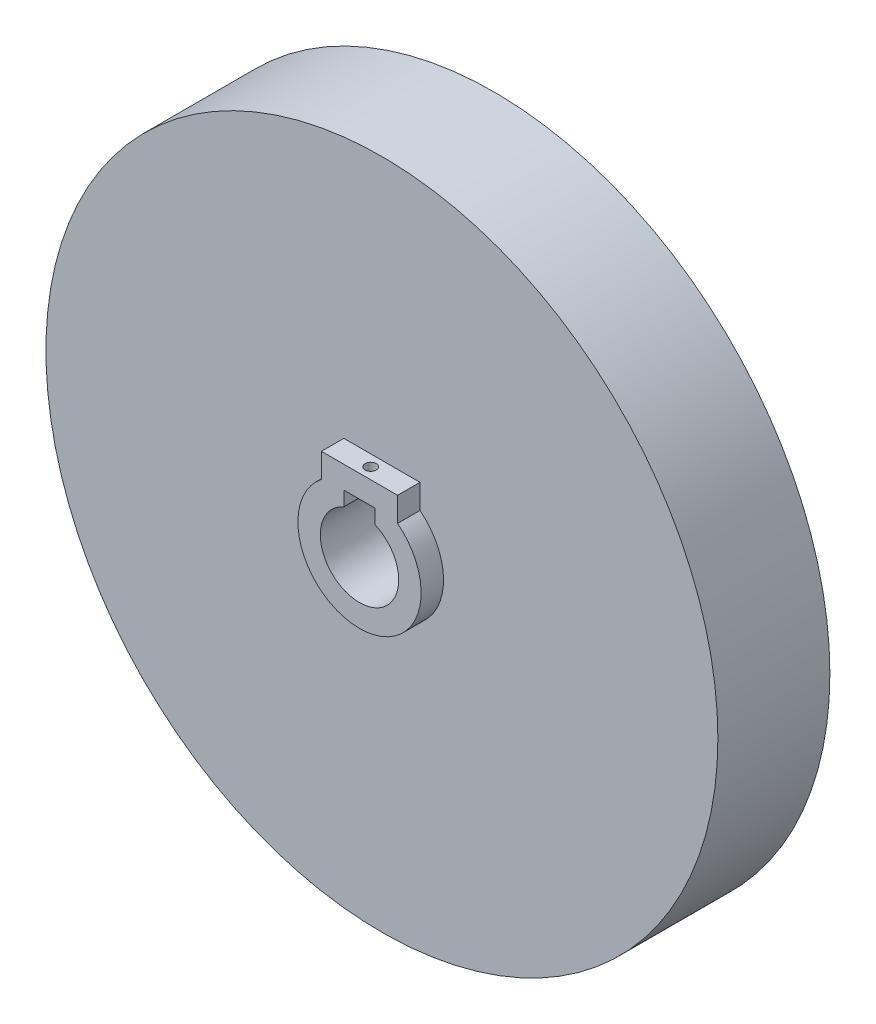
ISO-10303-21;
HEADER;
FILE_DESCRIPTION(('STEP AP214'),'2;1');
FILE_NAME('part.step','',(''),(''),'','','');
FILE_SCHEMA(('AUTOMOTIVE_DESIGN { 1 0 10303 214 1 1 1 1 }'));
ENDSEC;
DATA;
#1=APPLICATION_CONTEXT('core data for automotive mechanical design processes');
#2=APPLICATION_PROTOCOL_DEFINITION('international standard','automotive_design',2000,#1);
#3=PRODUCT_CONTEXT('',#1,'mechanical');
#4=PRODUCT('Part','Part','',(#3));
#5=PRODUCT_RELATED_PRODUCT_CATEGORY('part','',(#4));
#6=PRODUCT_DEFINITION_FORMATION('','',#4);
#7=PRODUCT_DEFINITION_CONTEXT('part definition',#1,'design');
#8=PRODUCT_DEFINITION('design','',#6,#7);
#9=PRODUCT_DEFINITION_SHAPE('','',#8);
#10=(LENGTH_UNIT() NAMED_UNIT(*) SI_UNIT(.MILLI.,.METRE.));
#11=(NAMED_UNIT(*) PLANE_ANGLE_UNIT() SI_UNIT($,.RADIAN.));
#12=(NAMED_UNIT(*) SI_UNIT($,.STERADIAN.) SOLID_ANGLE_UNIT());
#13=UNCERTAINTY_MEASURE_WITH_UNIT(LENGTH_MEASURE(1.E-05),#10,'distance_accuracy_value','');
#14=(GEOMETRIC_REPRESENTATION_CONTEXT(3) GLOBAL_UNCERTAINTY_ASSIGNED_CONTEXT((#13)) GLOBAL_UNIT_ASSIGNED_CONTEXT((#10,
#11,#12)) REPRESENTATION_CONTEXT('',''));
#15=CARTESIAN_POINT('',(0.,0.,0.));
#16=DIRECTION('',(0.,0.,1.));
#17=DIRECTION('',(1.,0.,0.));
#18=AXIS2_PLACEMENT_3D('',#15,#16,#17);
#19=CARTESIAN_POINT('',(0.,0.,50.));
#20=DIRECTION('',(0.,0.,1.));
#21=DIRECTION('',(1.,0.,0.));
#22=AXIS2_PLACEMENT_3D('',#19,#20,#21);
#23=PLANE('',#22);
#24=CARTESIAN_POINT('',(0.,0.,50.));
#25=DIRECTION('',(0.,0.,1.));
#26=DIRECTION('',(1.,0.,0.));
#27=AXIS2_PLACEMENT_3D('',#24,#25,#26);
#28=CIRCLE('',#27,27.5);
#29=CARTESIAN_POINT('',(-17.,21.6159663212173,50.));
#30=VERTEX_POINT('',#29);
#31=CARTESIAN_POINT('',(17.,21.6159663212173,50.));
#32=VERTEX_POINT('',#31);
#33=EDGE_CURVE('E59',#30,#32,#28,.T.);
#34=ORIENTED_EDGE('',*,*,#33,.F.);
#35=DIRECTION('',(0.,-1.,0.));
#36=VECTOR('',#35,1.);
#37=CARTESIAN_POINT('',(-17.,0.,50.));
#38=LINE('',#37,#36);
#39=CARTESIAN_POINT('',(-17.,32.5,50.));
#40=VERTEX_POINT('',#39);
#41=EDGE_CURVE('E63',#40,#30,#38,.T.);
#42=ORIENTED_EDGE('',*,*,#41,.F.);
#43=DIRECTION('',(-1.,0.,0.));
#44=VECTOR('',#43,1.);
#45=CARTESIAN_POINT('',(0.,32.5,50.));
#46=LINE('',#45,#44);
#47=CARTESIAN_POINT('',(17.,32.5,50.));
#48=VERTEX_POINT('',#47);
#49=EDGE_CURVE('E213',#48,#40,#46,.T.);
#50=ORIENTED_EDGE('',*,*,#49,.F.);
#51=DIRECTION('',(0.,1.,0.));
#52=VECTOR('',#51,1.);
#53=CARTESIAN_POINT('',(17.,0.,50.));
#54=LINE('',#53,#52);
#55=EDGE_CURVE('E199',#32,#48,#54,.T.);
#56=ORIENTED_EDGE('',*,*,#55,.F.);
#57=EDGE_LOOP('',(#34,#42,#50,#56));
#58=FACE_BOUND('',#57,.T.);
#59=CARTESIAN_POINT('',(0.,0.,50.));
#60=DIRECTION('',(0.,0.,1.));
#61=DIRECTION('',(1.,0.,0.));
#62=AXIS2_PLACEMENT_3D('',#59,#60,#61);
#63=CIRCLE('',#62,150.);
#64=CARTESIAN_POINT('',(150.,0.,50.));
#65=VERTEX_POINT('',#64);
#66=EDGE_CURVE('E222',#65,#65,#63,.T.);
#67=ORIENTED_EDGE('',*,*,#66,.T.);
#68=EDGE_LOOP('',(#67));
#69=FACE_BOUND('',#68,.T.);
#70=ADVANCED_FACE('F44',(#58,#69),#23,.T.);
#71=CARTESIAN_POINT('',(0.,0.,0.));
#72=DIRECTION('',(0.,0.,1.));
#73=DIRECTION('',(1.,0.,0.));
#74=AXIS2_PLACEMENT_3D('',#71,#72,#73);
#75=PLANE('',#74);
#76=DIRECTION('',(0.,-1.,0.));
#77=VECTOR('',#76,1.);
#78=CARTESIAN_POINT('',(-17.,0.,0.));
#79=LINE('',#78,#77);
#80=CARTESIAN_POINT('',(-17.,32.5,0.));
#81=VERTEX_POINT('',#80);
#82=CARTESIAN_POINT('',(-17.,21.6159663212173,0.));
#83=VERTEX_POINT('',#82);
#84=EDGE_CURVE('E52',#81,#83,#79,.T.);
#85=ORIENTED_EDGE('',*,*,#84,.T.);
#86=CARTESIAN_POINT('',(0.,0.,0.));
#87=DIRECTION('',(0.,0.,1.));
#88=DIRECTION('',(1.,0.,0.));
#89=AXIS2_PLACEMENT_3D('',#86,#87,#88);
#90=CIRCLE('',#89,27.5);
#91=CARTESIAN_POINT('',(17.,21.6159663212173,0.));
#92=VERTEX_POINT('',#91);
#93=EDGE_CURVE('E13',#83,#92,#90,.T.);
#94=ORIENTED_EDGE('',*,*,#93,.T.);
#95=DIRECTION('',(0.,1.,0.));
#96=VECTOR('',#95,1.);
#97=CARTESIAN_POINT('',(17.,0.,0.));
#98=LINE('',#97,#96);
#99=CARTESIAN_POINT('',(17.,32.5,0.));
#100=VERTEX_POINT('',#99);
#101=EDGE_CURVE('E225',#92,#100,#98,.T.);
#102=ORIENTED_EDGE('',*,*,#101,.T.);
#103=DIRECTION('',(-1.,0.,0.));
#104=VECTOR('',#103,1.);
#105=CARTESIAN_POINT('',(0.,32.5,0.));
#106=LINE('',#105,#104);
#107=EDGE_CURVE('E230',#100,#81,#106,.T.);
#108=ORIENTED_EDGE('',*,*,#107,.T.);
#109=EDGE_LOOP('',(#85,#94,#102,#108));
#110=FACE_BOUND('',#109,.T.);
#111=CARTESIAN_POINT('',(0.,0.,0.));
#112=DIRECTION('',(0.,0.,1.));
#113=DIRECTION('',(1.,0.,0.));
#114=AXIS2_PLACEMENT_3D('',#111,#112,#113);
#115=CIRCLE('',#114,150.);
#116=CARTESIAN_POINT('',(150.,0.,0.));
#117=VERTEX_POINT('',#116);
#118=EDGE_CURVE('E221',#117,#117,#115,.T.);
#119=ORIENTED_EDGE('',*,*,#118,.F.);
#120=EDGE_LOOP('',(#119));
#121=FACE_BOUND('',#120,.T.);
#122=ADVANCED_FACE('F234',(#110,#121),#75,.F.);
#123=CARTESIAN_POINT('',(0.,0.,50.));
#124=DIRECTION('',(0.,0.,-1.));
#125=DIRECTION('',(-1.,0.,0.));
#126=AXIS2_PLACEMENT_3D('',#123,#124,#125);
#127=CYLINDRICAL_SURFACE('',#126,150.);
#128=ORIENTED_EDGE('',*,*,#66,.F.);
#129=EDGE_LOOP('',(#128));
#130=FACE_BOUND('',#129,.T.);
#131=ORIENTED_EDGE('',*,*,#118,.T.);
#132=EDGE_LOOP('',(#131));
#133=FACE_BOUND('',#132,.T.);
#134=ADVANCED_FACE('F46',(#130,#133),#127,.T.);
#135=CARTESIAN_POINT('',(17.,21.6159663212173,-9.99999999999999));
#136=DIRECTION('',(1.,0.,0.));
#137=DIRECTION('',(0.,0.,-1.));
#138=AXIS2_PLACEMENT_3D('',#135,#136,#137);
#139=PLANE('',#138);
#140=ORIENTED_EDGE('',*,*,#101,.F.);
#141=DIRECTION('',(0.,0.,1.));
#142=VECTOR('',#141,1.);
#143=CARTESIAN_POINT('',(17.,21.6159663212173,-9.99999999999999));
#144=LINE('',#143,#142);
#145=CARTESIAN_POINT('',(17.,21.6159663212173,-9.99999999999999));
#146=VERTEX_POINT('',#145);
#147=EDGE_CURVE('E208',#146,#92,#144,.T.);
#148=ORIENTED_EDGE('',*,*,#147,.F.);
#149=DIRECTION('',(0.,1.,0.));
#150=VECTOR('',#149,1.);
#151=CARTESIAN_POINT('',(17.,21.6159663212173,-9.99999999999999));
#152=LINE('',#151,#150);
#153=CARTESIAN_POINT('',(17.,32.5,-9.99999999999999));
#154=VERTEX_POINT('',#153);
#155=EDGE_CURVE('E186',#146,#154,#152,.T.);
#156=ORIENTED_EDGE('',*,*,#155,.T.);
#157=DIRECTION('',(0.,0.,1.));
#158=VECTOR('',#157,1.);
#159=CARTESIAN_POINT('',(17.,32.5,-9.99999999999999));
#160=LINE('',#159,#158);
#161=EDGE_CURVE('E205',#154,#100,#160,.T.);
#162=ORIENTED_EDGE('',*,*,#161,.T.);
#163=EDGE_LOOP('',(#140,#148,#156,#162));
#164=FACE_BOUND('',#163,.T.);
#165=ADVANCED_FACE('F250',(#164),#139,.T.);
#166=CARTESIAN_POINT('',(17.,32.5,-9.99999999999999));
#167=DIRECTION('',(0.,1.,0.));
#168=DIRECTION('',(0.,0.,1.));
#169=AXIS2_PLACEMENT_3D('',#166,#167,#168);
#170=PLANE('',#169);
#171=ORIENTED_EDGE('',*,*,#107,.F.);
#172=ORIENTED_EDGE('',*,*,#161,.F.);
#173=DIRECTION('',(-1.,0.,0.));
#174=VECTOR('',#173,1.);
#175=CARTESIAN_POINT('',(17.,32.5,-9.99999999999999));
#176=LINE('',#175,#174);
#177=CARTESIAN_POINT('',(-17.,32.5,-9.99999999999999));
#178=VERTEX_POINT('',#177);
#179=EDGE_CURVE('E189',#154,#178,#176,.T.);
#180=ORIENTED_EDGE('',*,*,#179,.T.);
#181=DIRECTION('',(0.,0.,1.));
#182=VECTOR('',#181,1.);
#183=CARTESIAN_POINT('',(-17.,32.5,-9.99999999999999));
#184=LINE('',#183,#182);
#185=EDGE_CURVE('E201',#178,#81,#184,.T.);
#186=ORIENTED_EDGE('',*,*,#185,.T.);
#187=EDGE_LOOP('',(#171,#172,#180,#186));
#188=FACE_BOUND('',#187,.T.);
#189=ADVANCED_FACE('F240',(#188),#170,.T.);
#190=CARTESIAN_POINT('',(-17.,32.5,-9.99999999999999));
#191=DIRECTION('',(-1.,0.,0.));
#192=DIRECTION('',(0.,0.,1.));
#193=AXIS2_PLACEMENT_3D('',#190,#191,#192);
#194=PLANE('',#193);
#195=ORIENTED_EDGE('',*,*,#84,.F.);
#196=ORIENTED_EDGE('',*,*,#185,.F.);
#197=DIRECTION('',(0.,-1.,0.));
#198=VECTOR('',#197,1.);
#199=CARTESIAN_POINT('',(-17.,32.5,-9.99999999999999));
#200=LINE('',#199,#198);
#201=CARTESIAN_POINT('',(-17.,21.6159663212173,-9.99999999999999));
#202=VERTEX_POINT('',#201);
#203=EDGE_CURVE('E192',#178,#202,#200,.T.);
#204=ORIENTED_EDGE('',*,*,#203,.T.);
#205=DIRECTION('',(0.,0.,1.));
#206=VECTOR('',#205,1.);
#207=CARTESIAN_POINT('',(-17.,21.6159663212173,-9.99999999999999));
#208=LINE('',#207,#206);
#209=EDGE_CURVE('E196',#202,#83,#208,.T.);
#210=ORIENTED_EDGE('',*,*,#209,.T.);
#211=EDGE_LOOP('',(#195,#196,#204,#210));
#212=FACE_BOUND('',#211,.T.);
#213=ADVANCED_FACE('F238',(#212),#194,.T.);
#214=CARTESIAN_POINT('',(0.,0.,-9.99999999999999));
#215=DIRECTION('',(0.,0.,1.));
#216=DIRECTION('',(1.,0.,0.));
#217=AXIS2_PLACEMENT_3D('',#214,#215,#216);
#218=CYLINDRICAL_SURFACE('',#217,27.5);
#219=ORIENTED_EDGE('',*,*,#93,.F.);
#220=ORIENTED_EDGE('',*,*,#209,.F.);
#221=CARTESIAN_POINT('',(0.,0.,-9.99999999999999));
#222=DIRECTION('',(0.,0.,1.));
#223=DIRECTION('',(1.,0.,0.));
#224=AXIS2_PLACEMENT_3D('',#221,#222,#223);
#225=CIRCLE('',#224,27.5);
#226=EDGE_CURVE('E183',#202,#146,#225,.T.);
#227=ORIENTED_EDGE('',*,*,#226,.T.);
#228=ORIENTED_EDGE('',*,*,#147,.T.);
#229=EDGE_LOOP('',(#219,#220,#227,#228));
#230=FACE_BOUND('',#229,.T.);
#231=ADVANCED_FACE('F248',(#230),#218,.T.);
#232=CARTESIAN_POINT('',(0.,0.,-9.99999999999999));
#233=DIRECTION('',(0.,0.,1.));
#234=DIRECTION('',(1.,0.,0.));
#235=AXIS2_PLACEMENT_3D('',#232,#233,#234);
#236=PLANE('',#235);
#237=DIRECTION('',(0.,-1.,0.));
#238=VECTOR('',#237,1.);
#239=CARTESIAN_POINT('',(-7.,22.5,-9.99999999999999));
#240=LINE('',#239,#238);
#241=CARTESIAN_POINT('',(-7.,22.5,-9.99999999999999));
#242=VERTEX_POINT('',#241);
#243=CARTESIAN_POINT('',(-7.,16.0390149323454,-9.99999999999999));
#244=VERTEX_POINT('',#243);
#245=EDGE_CURVE('E180',#242,#244,#240,.T.);
#246=ORIENTED_EDGE('',*,*,#245,.T.);
#247=CARTESIAN_POINT('',(0.,0.,-9.99999999999999));
#248=DIRECTION('',(0.,0.,1.));
#249=DIRECTION('',(1.,0.,0.));
#250=AXIS2_PLACEMENT_3D('',#247,#248,#249);
#251=CIRCLE('',#250,17.5);
#252=CARTESIAN_POINT('',(7.,16.0390149323454,-9.99999999999999));
#253=VERTEX_POINT('',#252);
#254=EDGE_CURVE('E174',#244,#253,#251,.T.);
#255=ORIENTED_EDGE('',*,*,#254,.T.);
#256=DIRECTION('',(0.,1.,0.));
#257=VECTOR('',#256,1.);
#258=CARTESIAN_POINT('',(7.,16.0390149323454,-9.99999999999999));
#259=LINE('',#258,#257);
#260=CARTESIAN_POINT('',(7.,22.5,-9.99999999999999));
#261=VERTEX_POINT('',#260);
#262=EDGE_CURVE('E138',#253,#261,#259,.T.);
#263=ORIENTED_EDGE('',*,*,#262,.T.);
#264=DIRECTION('',(-1.,0.,0.));
#265=VECTOR('',#264,1.);
#266=CARTESIAN_POINT('',(7.,22.5,-9.99999999999999));
#267=LINE('',#266,#265);
#268=EDGE_CURVE('E177',#261,#242,#267,.T.);
#269=ORIENTED_EDGE('',*,*,#268,.T.);
#270=EDGE_LOOP('',(#246,#255,#263,#269));
#271=FACE_BOUND('',#270,.T.);
#272=ORIENTED_EDGE('',*,*,#226,.F.);
#273=ORIENTED_EDGE('',*,*,#203,.F.);
#274=ORIENTED_EDGE('',*,*,#179,.F.);
#275=ORIENTED_EDGE('',*,*,#155,.F.);
#276=EDGE_LOOP('',(#272,#273,#274,#275));
#277=FACE_BOUND('',#276,.T.);
#278=ADVANCED_FACE('F246',(#271,#277),#236,.F.);
#279=CARTESIAN_POINT('',(7.,22.5,50.));
#280=DIRECTION('',(-1.,0.,0.));
#281=DIRECTION('',(0.,0.,1.));
#282=AXIS2_PLACEMENT_3D('',#279,#280,#281);
#283=PLANE('',#282);
#284=DIRECTION('',(0.,0.,-1.));
#285=VECTOR('',#284,1.);
#286=CARTESIAN_POINT('',(7.,22.5,50.));
#287=LINE('',#286,#285);
#288=CARTESIAN_POINT('',(7.,22.5,60.));
#289=VERTEX_POINT('',#288);
#290=EDGE_CURVE('E143',#289,#261,#287,.T.);
#291=ORIENTED_EDGE('',*,*,#290,.T.);
#292=ORIENTED_EDGE('',*,*,#262,.F.);
#293=DIRECTION('',(0.,0.,-1.));
#294=VECTOR('',#293,1.);
#295=CARTESIAN_POINT('',(7.,16.0390149323454,50.));
#296=LINE('',#295,#294);
#297=CARTESIAN_POINT('',(7.,16.0390149323454,60.));
#298=VERTEX_POINT('',#297);
#299=EDGE_CURVE('E131',#298,#253,#296,.T.);
#300=ORIENTED_EDGE('',*,*,#299,.F.);
#301=DIRECTION('',(0.,1.,0.));
#302=VECTOR('',#301,1.);
#303=CARTESIAN_POINT('',(7.,16.0390149323454,60.));
#304=LINE('',#303,#302);
#305=EDGE_CURVE('E135',#298,#289,#304,.T.);
#306=ORIENTED_EDGE('',*,*,#305,.T.);
#307=EDGE_LOOP('',(#291,#292,#300,#306));
#308=FACE_BOUND('',#307,.T.);
#309=ADVANCED_FACE('F133',(#308),#283,.T.);
#310=CARTESIAN_POINT('',(-7.,22.5,50.));
#311=DIRECTION('',(0.,-1.,0.));
#312=DIRECTION('',(0.,0.,-1.));
#313=AXIS2_PLACEMENT_3D('',#310,#311,#312);
#314=PLANE('',#313);
#315=CARTESIAN_POINT('',(0.,22.5,55.));
#316=DIRECTION('',(0.,1.,0.));
#317=DIRECTION('',(0.,0.,1.));
#318=AXIS2_PLACEMENT_3D('',#315,#316,#317);
#319=CIRCLE('',#318,2.5);
#320=CARTESIAN_POINT('',(0.,22.5,57.5));
#321=VERTEX_POINT('',#320);
#322=EDGE_CURVE('E151',#321,#321,#319,.T.);
#323=ORIENTED_EDGE('',*,*,#322,.T.);
#324=EDGE_LOOP('',(#323));
#325=FACE_BOUND('',#324,.T.);
#326=DIRECTION('',(0.,0.,-1.));
#327=VECTOR('',#326,1.);
#328=CARTESIAN_POINT('',(-7.,22.5,50.));
#329=LINE('',#328,#327);
#330=CARTESIAN_POINT('',(-7.,22.5,60.));
#331=VERTEX_POINT('',#330);
#332=EDGE_CURVE('E217',#331,#242,#329,.T.);
#333=ORIENTED_EDGE('',*,*,#332,.T.);
#334=ORIENTED_EDGE('',*,*,#268,.F.);
#335=ORIENTED_EDGE('',*,*,#290,.F.);
#336=DIRECTION('',(-1.,0.,0.));
#337=VECTOR('',#336,1.);
#338=CARTESIAN_POINT('',(7.,22.5,60.));
#339=LINE('',#338,#337);
#340=EDGE_CURVE('E155',#289,#331,#339,.T.);
#341=ORIENTED_EDGE('',*,*,#340,.T.);
#342=EDGE_LOOP('',(#333,#334,#335,#341));
#343=FACE_BOUND('',#342,.T.);
#344=ADVANCED_FACE('F274',(#325,#343),#314,.T.);
#345=CARTESIAN_POINT('',(-7.,22.5,50.));
#346=DIRECTION('',(1.,0.,0.));
#347=DIRECTION('',(0.,0.,-1.));
#348=AXIS2_PLACEMENT_3D('',#345,#346,#347);
#349=PLANE('',#348);
#350=DIRECTION('',(0.,0.,-1.));
#351=VECTOR('',#350,1.);
#352=CARTESIAN_POINT('',(-7.,16.0390149323454,50.));
#353=LINE('',#352,#351);
#354=CARTESIAN_POINT('',(-7.,16.0390149323454,60.));
#355=VERTEX_POINT('',#354);
#356=EDGE_CURVE('E142',#355,#244,#353,.T.);
#357=ORIENTED_EDGE('',*,*,#356,.T.);
#358=ORIENTED_EDGE('',*,*,#245,.F.);
#359=ORIENTED_EDGE('',*,*,#332,.F.);
#360=DIRECTION('',(0.,-1.,0.));
#361=VECTOR('',#360,1.);
#362=CARTESIAN_POINT('',(-7.,22.5,60.));
#363=LINE('',#362,#361);
#364=EDGE_CURVE('E157',#331,#355,#363,.T.);
#365=ORIENTED_EDGE('',*,*,#364,.T.);
#366=EDGE_LOOP('',(#357,#358,#359,#365));
#367=FACE_BOUND('',#366,.T.);
#368=ADVANCED_FACE('F271',(#367),#349,.T.);
#369=CARTESIAN_POINT('',(0.,0.,50.));
#370=DIRECTION('',(0.,0.,-1.));
#371=DIRECTION('',(-1.,0.,0.));
#372=AXIS2_PLACEMENT_3D('',#369,#370,#371);
#373=CYLINDRICAL_SURFACE('',#372,17.5);
#374=ORIENTED_EDGE('',*,*,#299,.T.);
#375=ORIENTED_EDGE('',*,*,#254,.F.);
#376=ORIENTED_EDGE('',*,*,#356,.F.);
#377=CARTESIAN_POINT('',(0.,0.,60.));
#378=DIRECTION('',(0.,0.,1.));
#379=DIRECTION('',(1.,0.,0.));
#380=AXIS2_PLACEMENT_3D('',#377,#378,#379);
#381=CIRCLE('',#380,17.5);
#382=EDGE_CURVE('E146',#355,#298,#381,.T.);
#383=ORIENTED_EDGE('',*,*,#382,.T.);
#384=EDGE_LOOP('',(#374,#375,#376,#383));
#385=FACE_BOUND('',#384,.T.);
#386=ADVANCED_FACE('F147',(#385),#373,.F.);
#387=CARTESIAN_POINT('',(-17.,21.6159663212173,60.));
#388=VERTEX_POINT('',#387);
#389=EDGE_CURVE('E200',#30,#388,#208,.T.);
#390=ORIENTED_EDGE('',*,*,#389,.F.);
#391=ORIENTED_EDGE('',*,*,#33,.T.);
#392=CARTESIAN_POINT('',(17.,21.6159663212173,60.));
#393=VERTEX_POINT('',#392);
#394=EDGE_CURVE('E195',#32,#393,#144,.T.);
#395=ORIENTED_EDGE('',*,*,#394,.T.);
#396=CARTESIAN_POINT('',(0.,0.,60.));
#397=DIRECTION('',(0.,0.,1.));
#398=DIRECTION('',(1.,0.,0.));
#399=AXIS2_PLACEMENT_3D('',#396,#397,#398);
#400=CIRCLE('',#399,27.5);
#401=EDGE_CURVE('E162',#388,#393,#400,.T.);
#402=ORIENTED_EDGE('',*,*,#401,.F.);
#403=EDGE_LOOP('',(#390,#391,#395,#402));
#404=FACE_BOUND('',#403,.T.);
#405=ADVANCED_FACE('F278',(#404),#218,.T.);
#406=CARTESIAN_POINT('',(-17.,32.5,60.));
#407=VERTEX_POINT('',#406);
#408=EDGE_CURVE('E204',#40,#407,#184,.T.);
#409=ORIENTED_EDGE('',*,*,#408,.F.);
#410=ORIENTED_EDGE('',*,*,#41,.T.);
#411=ORIENTED_EDGE('',*,*,#389,.T.);
#412=DIRECTION('',(0.,-1.,0.));
#413=VECTOR('',#412,1.);
#414=CARTESIAN_POINT('',(-17.,32.5,60.));
#415=LINE('',#414,#413);
#416=EDGE_CURVE('E171',#407,#388,#415,.T.);
#417=ORIENTED_EDGE('',*,*,#416,.F.);
#418=EDGE_LOOP('',(#409,#410,#411,#417));
#419=FACE_BOUND('',#418,.T.);
#420=ADVANCED_FACE('F284',(#419),#194,.T.);
#421=CARTESIAN_POINT('',(0.,32.5,55.));
#422=DIRECTION('',(0.,1.,0.));
#423=DIRECTION('',(0.,0.,1.));
#424=AXIS2_PLACEMENT_3D('',#421,#422,#423);
#425=CIRCLE('',#424,2.5);
#426=CARTESIAN_POINT('',(0.,32.5,57.5));
#427=VERTEX_POINT('',#426);
#428=EDGE_CURVE('E309',#427,#427,#425,.T.);
#429=ORIENTED_EDGE('',*,*,#428,.F.);
#430=EDGE_LOOP('',(#429));
#431=FACE_BOUND('',#430,.T.);
#432=CARTESIAN_POINT('',(17.,32.5,60.));
#433=VERTEX_POINT('',#432);
#434=EDGE_CURVE('E207',#48,#433,#160,.T.);
#435=ORIENTED_EDGE('',*,*,#434,.F.);
#436=ORIENTED_EDGE('',*,*,#49,.T.);
#437=ORIENTED_EDGE('',*,*,#408,.T.);
#438=DIRECTION('',(-1.,0.,0.));
#439=VECTOR('',#438,1.);
#440=CARTESIAN_POINT('',(17.,32.5,60.));
#441=LINE('',#440,#439);
#442=EDGE_CURVE('E168',#433,#407,#441,.T.);
#443=ORIENTED_EDGE('',*,*,#442,.F.);
#444=EDGE_LOOP('',(#435,#436,#437,#443));
#445=FACE_BOUND('',#444,.T.);
#446=ADVANCED_FACE('F259',(#431,#445),#170,.T.);
#447=ORIENTED_EDGE('',*,*,#394,.F.);
#448=ORIENTED_EDGE('',*,*,#55,.T.);
#449=ORIENTED_EDGE('',*,*,#434,.T.);
#450=DIRECTION('',(0.,1.,0.));
#451=VECTOR('',#450,1.);
#452=CARTESIAN_POINT('',(17.,21.6159663212173,60.));
#453=LINE('',#452,#451);
#454=EDGE_CURVE('E165',#393,#433,#453,.T.);
#455=ORIENTED_EDGE('',*,*,#454,.F.);
#456=EDGE_LOOP('',(#447,#448,#449,#455));
#457=FACE_BOUND('',#456,.T.);
#458=ADVANCED_FACE('F253',(#457),#139,.T.);
#459=CARTESIAN_POINT('',(0.,0.,60.));
#460=DIRECTION('',(0.,0.,1.));
#461=DIRECTION('',(1.,0.,0.));
#462=AXIS2_PLACEMENT_3D('',#459,#460,#461);
#463=PLANE('',#462);
#464=ORIENTED_EDGE('',*,*,#401,.T.);
#465=ORIENTED_EDGE('',*,*,#454,.T.);
#466=ORIENTED_EDGE('',*,*,#442,.T.);
#467=ORIENTED_EDGE('',*,*,#416,.T.);
#468=EDGE_LOOP('',(#464,#465,#466,#467));
#469=FACE_BOUND('',#468,.T.);
#470=ORIENTED_EDGE('',*,*,#305,.F.);
#471=ORIENTED_EDGE('',*,*,#382,.F.);
#472=ORIENTED_EDGE('',*,*,#364,.F.);
#473=ORIENTED_EDGE('',*,*,#340,.F.);
#474=EDGE_LOOP('',(#470,#471,#472,#473));
#475=FACE_BOUND('',#474,.T.);
#476=ADVANCED_FACE('F153',(#469,#475),#463,.T.);
#477=CARTESIAN_POINT('',(0.,22.5,55.));
#478=DIRECTION('',(0.,1.,0.));
#479=DIRECTION('',(0.,0.,1.));
#480=AXIS2_PLACEMENT_3D('',#477,#478,#479);
#481=CYLINDRICAL_SURFACE('',#480,2.5);
#482=ORIENTED_EDGE('',*,*,#322,.F.);
#483=EDGE_LOOP('',(#482));
#484=FACE_BOUND('',#483,.T.);
#485=ORIENTED_EDGE('',*,*,#428,.T.);
#486=EDGE_LOOP('',(#485));
#487=FACE_BOUND('',#486,.T.);
#488=ADVANCED_FACE('F319',(#484,#487),#481,.F.);
#489=CLOSED_SHELL('',(#70,#122,#134,#165,#189,#213,#231,#278,#309,#344,#368,#386,#405,#420,#446,
#458,#476,#488));
#490=MANIFOLD_SOLID_BREP('B2',#489);
#491=ADVANCED_BREP_SHAPE_REPRESENTATION('',(#18,#490),#14);
#492=SHAPE_DEFINITION_REPRESENTATION(#9,#491);
ENDSEC;
END-ISO-10303-21;
